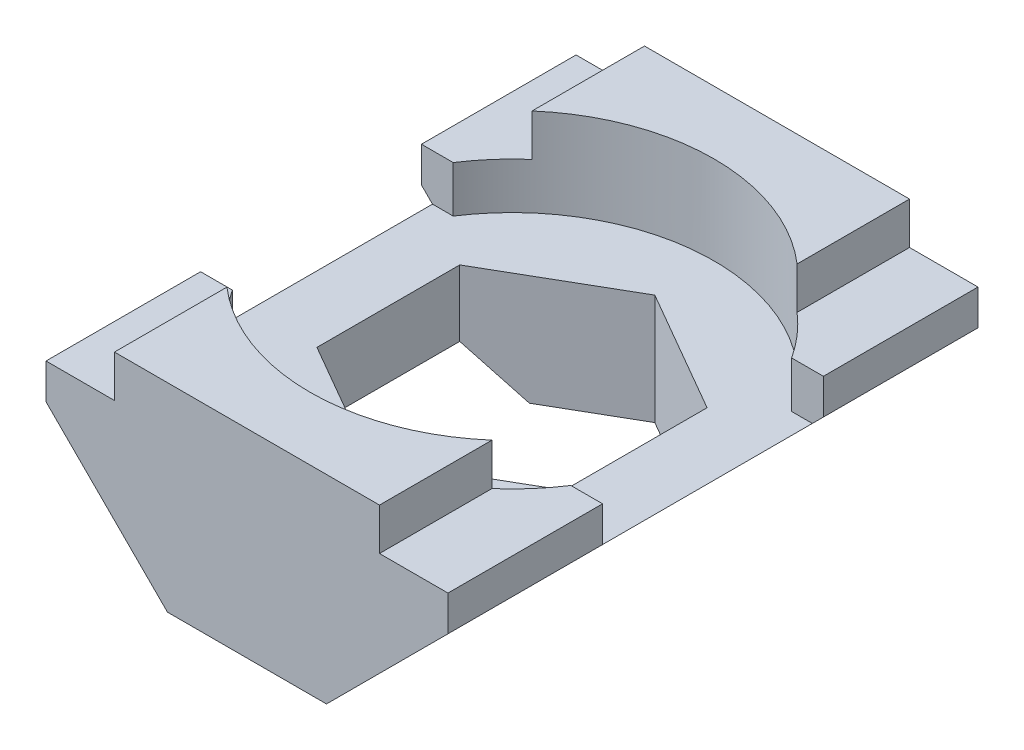
ISO-10303-21;
HEADER;
FILE_DESCRIPTION(('STEP AP214'),'2;1');
FILE_NAME('part.step','',(''),(''),'','','');
FILE_SCHEMA(('AUTOMOTIVE_DESIGN { 1 0 10303 214 1 1 1 1 }'));
ENDSEC;
DATA;
#1=APPLICATION_CONTEXT('core data for automotive mechanical design processes');
#2=APPLICATION_PROTOCOL_DEFINITION('international standard','automotive_design',2000,#1);
#3=PRODUCT_CONTEXT('',#1,'mechanical');
#4=PRODUCT('Part','Part','',(#3));
#5=PRODUCT_RELATED_PRODUCT_CATEGORY('part','',(#4));
#6=PRODUCT_DEFINITION_FORMATION('','',#4);
#7=PRODUCT_DEFINITION_CONTEXT('part definition',#1,'design');
#8=PRODUCT_DEFINITION('design','',#6,#7);
#9=PRODUCT_DEFINITION_SHAPE('','',#8);
#10=(LENGTH_UNIT() NAMED_UNIT(*) SI_UNIT(.MILLI.,.METRE.));
#11=(NAMED_UNIT(*) PLANE_ANGLE_UNIT() SI_UNIT($,.RADIAN.));
#12=(NAMED_UNIT(*) SI_UNIT($,.STERADIAN.) SOLID_ANGLE_UNIT());
#13=UNCERTAINTY_MEASURE_WITH_UNIT(LENGTH_MEASURE(1.E-05),#10,'distance_accuracy_value','');
#14=(GEOMETRIC_REPRESENTATION_CONTEXT(3) GLOBAL_UNCERTAINTY_ASSIGNED_CONTEXT((#13)) GLOBAL_UNIT_ASSIGNED_CONTEXT((#10,
#11,#12)) REPRESENTATION_CONTEXT('',''));
#15=CARTESIAN_POINT('',(0.,0.,0.));
#16=DIRECTION('',(0.,0.,1.));
#17=DIRECTION('',(1.,0.,0.));
#18=AXIS2_PLACEMENT_3D('',#15,#16,#17);
#19=CARTESIAN_POINT('',(4.79999999999999,-3.55,16.));
#20=DIRECTION('',(0.,1.,0.));
#21=DIRECTION('',(0.,0.,1.));
#22=AXIS2_PLACEMENT_3D('',#19,#20,#21);
#23=PLANE('',#22);
#24=DIRECTION('',(0.,0.,-1.));
#25=VECTOR('',#24,1.);
#26=CARTESIAN_POINT('',(4.79999999999999,-3.55,16.));
#27=LINE('',#26,#25);
#28=CARTESIAN_POINT('',(4.79999999999999,-3.55,14.));
#29=VERTEX_POINT('',#28);
#30=CARTESIAN_POINT('',(4.79999999999999,-3.55,10.1939310229206));
#31=VERTEX_POINT('',#30);
#32=EDGE_CURVE('E294',#29,#31,#27,.T.);
#33=ORIENTED_EDGE('',*,*,#32,.F.);
#34=DIRECTION('',(-1.,0.,0.));
#35=VECTOR('',#34,1.);
#36=CARTESIAN_POINT('',(-1.55,-3.55,14.));
#37=LINE('',#36,#35);
#38=CARTESIAN_POINT('',(1.20000000000001,-3.55,14.));
#39=VERTEX_POINT('',#38);
#40=EDGE_CURVE('E577',#29,#39,#37,.T.);
#41=ORIENTED_EDGE('',*,*,#40,.T.);
#42=DIRECTION('',(0.,0.,-1.));
#43=VECTOR('',#42,1.);
#44=CARTESIAN_POINT('',(1.20000000000001,-3.55,16.));
#45=LINE('',#44,#43);
#46=CARTESIAN_POINT('',(1.20000000000001,-3.55,10.1939310229206));
#47=VERTEX_POINT('',#46);
#48=EDGE_CURVE('E298',#39,#47,#45,.T.);
#49=ORIENTED_EDGE('',*,*,#48,.T.);
#50=DIRECTION('',(0.866025403784439,0.,0.499999999999999));
#51=VECTOR('',#50,1.);
#52=CARTESIAN_POINT('',(0.199999999999999,-3.55,9.61658075373095));
#53=LINE('',#52,#51);
#54=CARTESIAN_POINT('',(3.,-3.55,11.2331615074619));
#55=VERTEX_POINT('',#54);
#56=EDGE_CURVE('E469',#47,#55,#53,.T.);
#57=ORIENTED_EDGE('',*,*,#56,.T.);
#58=DIRECTION('',(0.866025403784438,0.,-0.5));
#59=VECTOR('',#58,1.);
#60=CARTESIAN_POINT('',(3.,-3.55,11.2331615074619));
#61=LINE('',#60,#59);
#62=EDGE_CURVE('E473',#55,#31,#61,.T.);
#63=ORIENTED_EDGE('',*,*,#62,.T.);
#64=EDGE_LOOP('',(#33,#41,#49,#57,#63));
#65=FACE_BOUND('',#64,.T.);
#66=ADVANCED_FACE('F38',(#65),#23,.F.);
#67=CARTESIAN_POINT('',(-1.55,0.,16.));
#68=DIRECTION('',(0.,-1.,0.));
#69=DIRECTION('',(1.,0.,0.));
#70=AXIS2_PLACEMENT_3D('',#67,#68,#69);
#71=PLANE('',#70);
#72=DIRECTION('',(0.,0.,-1.));
#73=VECTOR('',#72,1.);
#74=CARTESIAN_POINT('',(-1.55,0.,16.));
#75=LINE('',#74,#73);
#76=CARTESIAN_POINT('',(-1.55,0.,14.));
#77=VERTEX_POINT('',#76);
#78=CARTESIAN_POINT('',(-1.55,0.,10.5));
#79=VERTEX_POINT('',#78);
#80=EDGE_CURVE('E306',#77,#79,#75,.T.);
#81=ORIENTED_EDGE('',*,*,#80,.F.);
#82=DIRECTION('',(1.,0.,0.));
#83=VECTOR('',#82,1.);
#84=CARTESIAN_POINT('',(-1.55,0.,14.));
#85=LINE('',#84,#83);
#86=CARTESIAN_POINT('',(0.,0.,14.));
#87=VERTEX_POINT('',#86);
#88=EDGE_CURVE('E567',#77,#87,#85,.T.);
#89=ORIENTED_EDGE('',*,*,#88,.T.);
#90=DIRECTION('',(0.,0.,-1.));
#91=VECTOR('',#90,1.);
#92=CARTESIAN_POINT('',(0.,0.,16.));
#93=LINE('',#92,#91);
#94=CARTESIAN_POINT('',(0.,0.,11.4540736819008));
#95=VERTEX_POINT('',#94);
#96=EDGE_CURVE('E385',#87,#95,#93,.T.);
#97=ORIENTED_EDGE('',*,*,#96,.T.);
#98=CARTESIAN_POINT('',(3.,0.,8.));
#99=DIRECTION('',(0.,-1.,0.));
#100=DIRECTION('',(1.,0.,0.));
#101=AXIS2_PLACEMENT_3D('',#98,#99,#100);
#102=CIRCLE('',#101,4.575);
#103=CARTESIAN_POINT('',(-0.831530373101587,0.,10.5));
#104=VERTEX_POINT('',#103);
#105=EDGE_CURVE('E358',#95,#104,#102,.T.);
#106=ORIENTED_EDGE('',*,*,#105,.T.);
#107=DIRECTION('',(1.,0.,0.));
#108=VECTOR('',#107,1.);
#109=CARTESIAN_POINT('',(-1.55,0.,10.5));
#110=LINE('',#109,#108);
#111=EDGE_CURVE('E410',#79,#104,#110,.T.);
#112=ORIENTED_EDGE('',*,*,#111,.F.);
#113=EDGE_LOOP('',(#81,#89,#97,#106,#112));
#114=FACE_BOUND('',#113,.T.);
#115=ADVANCED_FACE('F643',(#114),#71,.F.);
#116=CARTESIAN_POINT('',(-1.55,-0.8,16.));
#117=DIRECTION('',(1.,0.,0.));
#118=DIRECTION('',(0.,0.,-1.));
#119=AXIS2_PLACEMENT_3D('',#116,#117,#118);
#120=PLANE('',#119);
#121=CARTESIAN_POINT('',(-1.55,0.,5.5));
#122=VERTEX_POINT('',#121);
#123=CARTESIAN_POINT('',(-1.55,0.,2.));
#124=VERTEX_POINT('',#123);
#125=EDGE_CURVE('E305',#122,#124,#75,.T.);
#126=ORIENTED_EDGE('',*,*,#125,.T.);
#127=DIRECTION('',(0.,1.,0.));
#128=VECTOR('',#127,1.);
#129=CARTESIAN_POINT('',(-1.55,-3.55,2.));
#130=LINE('',#129,#128);
#131=CARTESIAN_POINT('',(-1.55,-0.8,2.));
#132=VERTEX_POINT('',#131);
#133=EDGE_CURVE('E568',#132,#124,#130,.T.);
#134=ORIENTED_EDGE('',*,*,#133,.F.);
#135=DIRECTION('',(0.,0.,-1.));
#136=VECTOR('',#135,1.);
#137=CARTESIAN_POINT('',(-1.55,-0.8,16.));
#138=LINE('',#137,#136);
#139=CARTESIAN_POINT('',(-1.55,-0.800000000000002,5.5));
#140=VERTEX_POINT('',#139);
#141=EDGE_CURVE('E301',#140,#132,#138,.T.);
#142=ORIENTED_EDGE('',*,*,#141,.F.);
#143=DIRECTION('',(0.,1.,0.));
#144=VECTOR('',#143,1.);
#145=CARTESIAN_POINT('',(-1.55,-11.4331594420966,5.5));
#146=LINE('',#145,#144);
#147=EDGE_CURVE('E420',#140,#122,#146,.T.);
#148=ORIENTED_EDGE('',*,*,#147,.T.);
#149=EDGE_LOOP('',(#126,#134,#142,#148));
#150=FACE_BOUND('',#149,.T.);
#151=ADVANCED_FACE('F619',(#150),#120,.F.);
#152=CARTESIAN_POINT('',(7.55,0.,16.));
#153=DIRECTION('',(-1.,0.,0.));
#154=DIRECTION('',(0.,0.,1.));
#155=AXIS2_PLACEMENT_3D('',#152,#153,#154);
#156=PLANE('',#155);
#157=DIRECTION('',(0.,0.,-1.));
#158=VECTOR('',#157,1.);
#159=CARTESIAN_POINT('',(7.55,0.,16.));
#160=LINE('',#159,#158);
#161=CARTESIAN_POINT('',(7.55,0.,14.));
#162=VERTEX_POINT('',#161);
#163=CARTESIAN_POINT('',(7.55,0.,10.5));
#164=VERTEX_POINT('',#163);
#165=EDGE_CURVE('E286',#162,#164,#160,.T.);
#166=ORIENTED_EDGE('',*,*,#165,.F.);
#167=DIRECTION('',(0.,1.,0.));
#168=VECTOR('',#167,1.);
#169=CARTESIAN_POINT('',(7.55,-3.55,14.));
#170=LINE('',#169,#168);
#171=CARTESIAN_POINT('',(7.55,-0.799999999999999,14.));
#172=VERTEX_POINT('',#171);
#173=EDGE_CURVE('E581',#172,#162,#170,.T.);
#174=ORIENTED_EDGE('',*,*,#173,.F.);
#175=DIRECTION('',(0.,0.,-1.));
#176=VECTOR('',#175,1.);
#177=CARTESIAN_POINT('',(7.55,-0.799999999999999,16.));
#178=LINE('',#177,#176);
#179=CARTESIAN_POINT('',(7.55,-0.799999999999999,10.5));
#180=VERTEX_POINT('',#179);
#181=EDGE_CURVE('E290',#172,#180,#178,.T.);
#182=ORIENTED_EDGE('',*,*,#181,.T.);
#183=DIRECTION('',(0.,1.,0.));
#184=VECTOR('',#183,1.);
#185=CARTESIAN_POINT('',(7.55,-11.4331594420966,10.5));
#186=LINE('',#185,#184);
#187=EDGE_CURVE('E434',#180,#164,#186,.T.);
#188=ORIENTED_EDGE('',*,*,#187,.T.);
#189=EDGE_LOOP('',(#166,#174,#182,#188));
#190=FACE_BOUND('',#189,.T.);
#191=ADVANCED_FACE('F668',(#190),#156,.F.);
#192=CARTESIAN_POINT('',(6.,0.,16.));
#193=DIRECTION('',(0.,-1.,0.));
#194=DIRECTION('',(1.,0.,0.));
#195=AXIS2_PLACEMENT_3D('',#192,#193,#194);
#196=PLANE('',#195);
#197=DIRECTION('',(0.,0.,-1.));
#198=VECTOR('',#197,1.);
#199=CARTESIAN_POINT('',(6.,0.,16.));
#200=LINE('',#199,#198);
#201=CARTESIAN_POINT('',(6.,0.,14.));
#202=VERTEX_POINT('',#201);
#203=CARTESIAN_POINT('',(6.,0.,11.4540736819008));
#204=VERTEX_POINT('',#203);
#205=EDGE_CURVE('E282',#202,#204,#200,.T.);
#206=ORIENTED_EDGE('',*,*,#205,.F.);
#207=DIRECTION('',(1.,0.,0.));
#208=VECTOR('',#207,1.);
#209=CARTESIAN_POINT('',(6.,0.,14.));
#210=LINE('',#209,#208);
#211=EDGE_CURVE('E267',#202,#162,#210,.T.);
#212=ORIENTED_EDGE('',*,*,#211,.T.);
#213=ORIENTED_EDGE('',*,*,#165,.T.);
#214=CARTESIAN_POINT('',(6.83153037310159,0.,10.5));
#215=VERTEX_POINT('',#214);
#216=EDGE_CURVE('E406',#215,#164,#110,.T.);
#217=ORIENTED_EDGE('',*,*,#216,.F.);
#218=CARTESIAN_POINT('',(3.,0.,8.));
#219=DIRECTION('',(0.,-1.,0.));
#220=DIRECTION('',(1.,0.,0.));
#221=AXIS2_PLACEMENT_3D('',#218,#219,#220);
#222=CIRCLE('',#221,4.575);
#223=EDGE_CURVE('E341',#215,#204,#222,.T.);
#224=ORIENTED_EDGE('',*,*,#223,.T.);
#225=EDGE_LOOP('',(#206,#212,#213,#217,#224));
#226=FACE_BOUND('',#225,.T.);
#227=ADVANCED_FACE('F629',(#226),#196,.F.);
#228=CARTESIAN_POINT('',(6.,0.95,16.));
#229=DIRECTION('',(-1.,0.,0.));
#230=DIRECTION('',(0.,0.,1.));
#231=AXIS2_PLACEMENT_3D('',#228,#229,#230);
#232=PLANE('',#231);
#233=DIRECTION('',(0.,0.,-1.));
#234=VECTOR('',#233,1.);
#235=CARTESIAN_POINT('',(6.,0.95,16.));
#236=LINE('',#235,#234);
#237=CARTESIAN_POINT('',(6.,0.95,14.));
#238=VERTEX_POINT('',#237);
#239=CARTESIAN_POINT('',(6.,0.95,11.4540736819008));
#240=VERTEX_POINT('',#239);
#241=EDGE_CURVE('E273',#238,#240,#236,.T.);
#242=ORIENTED_EDGE('',*,*,#241,.F.);
#243=DIRECTION('',(0.,-1.,0.));
#244=VECTOR('',#243,1.);
#245=CARTESIAN_POINT('',(6.,0.95,14.));
#246=LINE('',#245,#244);
#247=EDGE_CURVE('E596',#238,#202,#246,.T.);
#248=ORIENTED_EDGE('',*,*,#247,.T.);
#249=ORIENTED_EDGE('',*,*,#205,.T.);
#250=DIRECTION('',(0.,1.,0.));
#251=VECTOR('',#250,1.);
#252=CARTESIAN_POINT('',(6.,-1.05,11.4540736819008));
#253=LINE('',#252,#251);
#254=EDGE_CURVE('E378',#204,#240,#253,.T.);
#255=ORIENTED_EDGE('',*,*,#254,.T.);
#256=EDGE_LOOP('',(#242,#248,#249,#255));
#257=FACE_BOUND('',#256,.T.);
#258=ADVANCED_FACE('F634',(#257),#232,.F.);
#259=CARTESIAN_POINT('',(0.,0.95,16.));
#260=DIRECTION('',(0.,-1.,0.));
#261=DIRECTION('',(0.,0.,-1.));
#262=AXIS2_PLACEMENT_3D('',#259,#260,#261);
#263=PLANE('',#262);
#264=DIRECTION('',(0.,0.,-1.));
#265=VECTOR('',#264,1.);
#266=CARTESIAN_POINT('',(0.,0.95,16.));
#267=LINE('',#266,#265);
#268=CARTESIAN_POINT('',(0.,0.95,14.));
#269=VERTEX_POINT('',#268);
#270=CARTESIAN_POINT('',(0.,0.95,11.4540736819008));
#271=VERTEX_POINT('',#270);
#272=EDGE_CURVE('E274',#269,#271,#267,.T.);
#273=ORIENTED_EDGE('',*,*,#272,.F.);
#274=DIRECTION('',(-1.,0.,0.));
#275=VECTOR('',#274,1.);
#276=CARTESIAN_POINT('',(-1.55,0.95,14.));
#277=LINE('',#276,#275);
#278=EDGE_CURVE('E62',#238,#269,#277,.T.);
#279=ORIENTED_EDGE('',*,*,#278,.F.);
#280=ORIENTED_EDGE('',*,*,#241,.T.);
#281=CARTESIAN_POINT('',(3.,0.95,8.));
#282=DIRECTION('',(0.,1.,0.));
#283=DIRECTION('',(0.,0.,1.));
#284=AXIS2_PLACEMENT_3D('',#281,#282,#283);
#285=CIRCLE('',#284,4.575);
#286=EDGE_CURVE('E359',#271,#240,#285,.T.);
#287=ORIENTED_EDGE('',*,*,#286,.F.);
#288=EDGE_LOOP('',(#273,#279,#280,#287));
#289=FACE_BOUND('',#288,.T.);
#290=ADVANCED_FACE('F638',(#289),#263,.F.);
#291=CARTESIAN_POINT('',(0.,0.,16.));
#292=DIRECTION('',(1.,0.,0.));
#293=DIRECTION('',(0.,0.,-1.));
#294=AXIS2_PLACEMENT_3D('',#291,#292,#293);
#295=PLANE('',#294);
#296=CARTESIAN_POINT('',(0.,0.95,4.54592631809916));
#297=VERTEX_POINT('',#296);
#298=CARTESIAN_POINT('',(0.,0.95,2.));
#299=VERTEX_POINT('',#298);
#300=EDGE_CURVE('E278',#297,#299,#267,.T.);
#301=ORIENTED_EDGE('',*,*,#300,.T.);
#302=DIRECTION('',(0.,-1.,0.));
#303=VECTOR('',#302,1.);
#304=CARTESIAN_POINT('',(0.,0.,2.));
#305=LINE('',#304,#303);
#306=CARTESIAN_POINT('',(0.,0.,2.));
#307=VERTEX_POINT('',#306);
#308=EDGE_CURVE('E54',#299,#307,#305,.T.);
#309=ORIENTED_EDGE('',*,*,#308,.T.);
#310=CARTESIAN_POINT('',(0.,0.,4.54592631809916));
#311=VERTEX_POINT('',#310);
#312=EDGE_CURVE('E384',#311,#307,#93,.T.);
#313=ORIENTED_EDGE('',*,*,#312,.F.);
#314=DIRECTION('',(0.,1.,0.));
#315=VECTOR('',#314,1.);
#316=CARTESIAN_POINT('',(0.,-1.05,4.54592631809916));
#317=LINE('',#316,#315);
#318=EDGE_CURVE('E313',#311,#297,#317,.T.);
#319=ORIENTED_EDGE('',*,*,#318,.T.);
#320=EDGE_LOOP('',(#301,#309,#313,#319));
#321=FACE_BOUND('',#320,.T.);
#322=ADVANCED_FACE('F404',(#321),#295,.F.);
#323=ORIENTED_EDGE('',*,*,#312,.T.);
#324=DIRECTION('',(-1.,0.,0.));
#325=VECTOR('',#324,1.);
#326=CARTESIAN_POINT('',(-1.55,0.,2.));
#327=LINE('',#326,#325);
#328=EDGE_CURVE('E398',#307,#124,#327,.T.);
#329=ORIENTED_EDGE('',*,*,#328,.T.);
#330=ORIENTED_EDGE('',*,*,#125,.F.);
#331=DIRECTION('',(-1.,0.,0.));
#332=VECTOR('',#331,1.);
#333=CARTESIAN_POINT('',(-1.55,0.,5.5));
#334=LINE('',#333,#332);
#335=CARTESIAN_POINT('',(-0.83153037310159,0.,5.5));
#336=VERTEX_POINT('',#335);
#337=EDGE_CURVE('E423',#336,#122,#334,.T.);
#338=ORIENTED_EDGE('',*,*,#337,.F.);
#339=EDGE_CURVE('E370',#336,#311,#102,.T.);
#340=ORIENTED_EDGE('',*,*,#339,.T.);
#341=EDGE_LOOP('',(#323,#329,#330,#338,#340));
#342=FACE_BOUND('',#341,.T.);
#343=ADVANCED_FACE('F40',(#342),#71,.F.);
#344=CARTESIAN_POINT('',(-1.55,-0.8,14.));
#345=VERTEX_POINT('',#344);
#346=CARTESIAN_POINT('',(-1.55,-0.800000000000002,10.5));
#347=VERTEX_POINT('',#346);
#348=EDGE_CURVE('E302',#345,#347,#138,.T.);
#349=ORIENTED_EDGE('',*,*,#348,.F.);
#350=DIRECTION('',(0.,1.,0.));
#351=VECTOR('',#350,1.);
#352=CARTESIAN_POINT('',(-1.55,-3.55,14.));
#353=LINE('',#352,#351);
#354=EDGE_CURVE('E255',#345,#77,#353,.T.);
#355=ORIENTED_EDGE('',*,*,#354,.T.);
#356=ORIENTED_EDGE('',*,*,#80,.T.);
#357=DIRECTION('',(0.,1.,0.));
#358=VECTOR('',#357,1.);
#359=CARTESIAN_POINT('',(-1.55,-11.4331594420966,10.5));
#360=LINE('',#359,#358);
#361=EDGE_CURVE('E427',#347,#79,#360,.T.);
#362=ORIENTED_EDGE('',*,*,#361,.F.);
#363=EDGE_LOOP('',(#349,#355,#356,#362));
#364=FACE_BOUND('',#363,.T.);
#365=ADVANCED_FACE('F650',(#364),#120,.F.);
#366=CARTESIAN_POINT('',(1.20000000000001,-3.55,16.));
#367=DIRECTION('',(0.707106781186546,0.707106781186549,0.));
#368=DIRECTION('',(-0.707106781186549,0.707106781186546,0.));
#369=AXIS2_PLACEMENT_3D('',#366,#367,#368);
#370=PLANE('',#369);
#371=ORIENTED_EDGE('',*,*,#141,.T.);
#372=DIRECTION('',(0.707106781186549,-0.707106781186546,0.));
#373=VECTOR('',#372,1.);
#374=CARTESIAN_POINT('',(1.20000000000001,-3.55,2.));
#375=LINE('',#374,#373);
#376=CARTESIAN_POINT('',(1.20000000000001,-3.55,2.));
#377=VERTEX_POINT('',#376);
#378=EDGE_CURVE('E412',#132,#377,#375,.T.);
#379=ORIENTED_EDGE('',*,*,#378,.T.);
#380=CARTESIAN_POINT('',(1.20000000000001,-3.55,5.80606897707941));
#381=VERTEX_POINT('',#380);
#382=EDGE_CURVE('E297',#381,#377,#45,.T.);
#383=ORIENTED_EDGE('',*,*,#382,.F.);
#384=DIRECTION('',(-0.654653670707978,0.654653670707976,0.377964473009228));
#385=VECTOR('',#384,1.);
#386=CARTESIAN_POINT('',(-1.32234378007872,-1.02765621992128,7.26234483749665));
#387=LINE('',#386,#385);
#388=CARTESIAN_POINT('',(0.199999999999997,-2.54999999999999,6.38341924626905));
#389=VERTEX_POINT('',#388);
#390=EDGE_CURVE('E499',#381,#389,#387,.T.);
#391=ORIENTED_EDGE('',*,*,#390,.T.);
#392=DIRECTION('',(0.,0.,1.));
#393=VECTOR('',#392,1.);
#394=CARTESIAN_POINT('',(0.200000000000002,-2.54999999999999,16.));
#395=LINE('',#394,#393);
#396=CARTESIAN_POINT('',(0.199999999999999,-2.54999999999999,9.61658075373095));
#397=VERTEX_POINT('',#396);
#398=EDGE_CURVE('E521',#389,#397,#395,.T.);
#399=ORIENTED_EDGE('',*,*,#398,.T.);
#400=DIRECTION('',(0.654653670707979,-0.654653670707976,0.377964473009227));
#401=VECTOR('',#400,1.);
#402=CARTESIAN_POINT('',(2.63662949436445,-4.98662949436443,11.0233694482176));
#403=LINE('',#402,#401);
#404=EDGE_CURVE('E525',#397,#47,#403,.T.);
#405=ORIENTED_EDGE('',*,*,#404,.T.);
#406=ORIENTED_EDGE('',*,*,#48,.F.);
#407=DIRECTION('',(-0.707106781186549,0.707106781186546,0.));
#408=VECTOR('',#407,1.);
#409=CARTESIAN_POINT('',(1.20000000000001,-3.55,14.));
#410=LINE('',#409,#408);
#411=EDGE_CURVE('E592',#39,#345,#410,.T.);
#412=ORIENTED_EDGE('',*,*,#411,.T.);
#413=ORIENTED_EDGE('',*,*,#348,.T.);
#414=DIRECTION('',(0.707106781186549,-0.707106781186546,0.));
#415=VECTOR('',#414,1.);
#416=CARTESIAN_POINT('',(1.20000000000001,-3.55,10.5));
#417=LINE('',#416,#415);
#418=CARTESIAN_POINT('',(-1.3,-1.05,10.5));
#419=VERTEX_POINT('',#418);
#420=EDGE_CURVE('E455',#347,#419,#417,.T.);
#421=ORIENTED_EDGE('',*,*,#420,.T.);
#422=DIRECTION('',(0.,0.,1.));
#423=VECTOR('',#422,1.);
#424=CARTESIAN_POINT('',(-1.3,-1.05,16.));
#425=LINE('',#424,#423);
#426=CARTESIAN_POINT('',(-1.3,-1.05,5.5));
#427=VERTEX_POINT('',#426);
#428=EDGE_CURVE('E382',#427,#419,#425,.T.);
#429=ORIENTED_EDGE('',*,*,#428,.F.);
#430=DIRECTION('',(-0.707106781186549,0.707106781186546,0.));
#431=VECTOR('',#430,1.);
#432=CARTESIAN_POINT('',(1.20000000000001,-3.55,5.5));
#433=LINE('',#432,#431);
#434=EDGE_CURVE('E447',#427,#140,#433,.T.);
#435=ORIENTED_EDGE('',*,*,#434,.T.);
#436=EDGE_LOOP('',(#371,#379,#383,#391,#399,#405,#406,#412,#413,#421,#429,#435));
#437=FACE_BOUND('',#436,.T.);
#438=ADVANCED_FACE('F612',(#437),#370,.F.);
#439=ORIENTED_EDGE('',*,*,#382,.T.);
#440=DIRECTION('',(1.,0.,0.));
#441=VECTOR('',#440,1.);
#442=CARTESIAN_POINT('',(-1.55,-3.55,2.));
#443=LINE('',#442,#441);
#444=CARTESIAN_POINT('',(4.79999999999999,-3.55,2.));
#445=VERTEX_POINT('',#444);
#446=EDGE_CURVE('E254',#377,#445,#443,.T.);
#447=ORIENTED_EDGE('',*,*,#446,.T.);
#448=CARTESIAN_POINT('',(4.79999999999999,-3.55,5.80606897707941));
#449=VERTEX_POINT('',#448);
#450=EDGE_CURVE('E293',#449,#445,#27,.T.);
#451=ORIENTED_EDGE('',*,*,#450,.F.);
#452=DIRECTION('',(-0.866025403784439,0.,-0.499999999999999));
#453=VECTOR('',#452,1.);
#454=CARTESIAN_POINT('',(5.8,-3.55,6.38341924626904));
#455=LINE('',#454,#453);
#456=CARTESIAN_POINT('',(3.,-3.55,4.7668384925381));
#457=VERTEX_POINT('',#456);
#458=EDGE_CURVE('E460',#449,#457,#455,.T.);
#459=ORIENTED_EDGE('',*,*,#458,.T.);
#460=DIRECTION('',(-0.866025403784439,0.,0.5));
#461=VECTOR('',#460,1.);
#462=CARTESIAN_POINT('',(3.,-3.55,4.7668384925381));
#463=LINE('',#462,#461);
#464=EDGE_CURVE('E464',#457,#381,#463,.T.);
#465=ORIENTED_EDGE('',*,*,#464,.T.);
#466=EDGE_LOOP('',(#439,#447,#451,#459,#465));
#467=FACE_BOUND('',#466,.T.);
#468=ADVANCED_FACE('F548',(#467),#23,.F.);
#469=CARTESIAN_POINT('',(7.55,-0.799999999999999,16.));
#470=DIRECTION('',(-0.707106781186546,0.707106781186549,0.));
#471=DIRECTION('',(-0.707106781186549,-0.707106781186546,0.));
#472=AXIS2_PLACEMENT_3D('',#469,#470,#471);
#473=PLANE('',#472);
#474=ORIENTED_EDGE('',*,*,#450,.T.);
#475=DIRECTION('',(0.707106781186549,0.707106781186546,0.));
#476=VECTOR('',#475,1.);
#477=CARTESIAN_POINT('',(7.55,-0.799999999999999,2.));
#478=LINE('',#477,#476);
#479=CARTESIAN_POINT('',(7.55,-0.799999999999999,2.));
#480=VERTEX_POINT('',#479);
#481=EDGE_CURVE('E605',#445,#480,#478,.T.);
#482=ORIENTED_EDGE('',*,*,#481,.T.);
#483=CARTESIAN_POINT('',(7.55,-0.799999999999999,5.5));
#484=VERTEX_POINT('',#483);
#485=EDGE_CURVE('E289',#484,#480,#178,.T.);
#486=ORIENTED_EDGE('',*,*,#485,.F.);
#487=DIRECTION('',(-0.707106781186549,-0.707106781186546,0.));
#488=VECTOR('',#487,1.);
#489=CARTESIAN_POINT('',(7.55,-0.799999999999999,5.5));
#490=LINE('',#489,#488);
#491=CARTESIAN_POINT('',(7.3,-1.05,5.5));
#492=VERTEX_POINT('',#491);
#493=EDGE_CURVE('E443',#484,#492,#490,.T.);
#494=ORIENTED_EDGE('',*,*,#493,.T.);
#495=DIRECTION('',(0.,0.,-1.));
#496=VECTOR('',#495,1.);
#497=CARTESIAN_POINT('',(7.3,-1.05,16.));
#498=LINE('',#497,#496);
#499=CARTESIAN_POINT('',(7.3,-1.05,10.5));
#500=VERTEX_POINT('',#499);
#501=EDGE_CURVE('E317',#500,#492,#498,.T.);
#502=ORIENTED_EDGE('',*,*,#501,.F.);
#503=DIRECTION('',(0.707106781186549,0.707106781186546,0.));
#504=VECTOR('',#503,1.);
#505=CARTESIAN_POINT('',(7.55,-0.799999999999999,10.5));
#506=LINE('',#505,#504);
#507=EDGE_CURVE('E451',#500,#180,#506,.T.);
#508=ORIENTED_EDGE('',*,*,#507,.T.);
#509=ORIENTED_EDGE('',*,*,#181,.F.);
#510=DIRECTION('',(-0.707106781186549,-0.707106781186546,0.));
#511=VECTOR('',#510,1.);
#512=CARTESIAN_POINT('',(7.55,-0.799999999999999,14.));
#513=LINE('',#512,#511);
#514=EDGE_CURVE('E572',#172,#29,#513,.T.);
#515=ORIENTED_EDGE('',*,*,#514,.T.);
#516=ORIENTED_EDGE('',*,*,#32,.T.);
#517=DIRECTION('',(0.654653670707978,0.654653670707976,-0.377964473009228));
#518=VECTOR('',#517,1.);
#519=CARTESIAN_POINT('',(5.72051336277842,-2.62948663722157,9.66247238512781));
#520=LINE('',#519,#518);
#521=CARTESIAN_POINT('',(5.8,-2.54999999999999,9.61658075373095));
#522=VERTEX_POINT('',#521);
#523=EDGE_CURVE('E529',#31,#522,#520,.T.);
#524=ORIENTED_EDGE('',*,*,#523,.T.);
#525=DIRECTION('',(0.,0.,-1.));
#526=VECTOR('',#525,1.);
#527=CARTESIAN_POINT('',(5.8,-2.54999999999999,16.));
#528=LINE('',#527,#526);
#529=CARTESIAN_POINT('',(5.8,-2.54999999999999,6.38341924626904));
#530=VERTEX_POINT('',#529);
#531=EDGE_CURVE('E532',#522,#530,#528,.T.);
#532=ORIENTED_EDGE('',*,*,#531,.T.);
#533=DIRECTION('',(-0.654653670707979,-0.654653670707976,-0.377964473009227));
#534=VECTOR('',#533,1.);
#535=CARTESIAN_POINT('',(9.67948663722158,1.32948663722157,8.62324190058647));
#536=LINE('',#535,#534);
#537=EDGE_CURVE('E362',#530,#449,#536,.T.);
#538=ORIENTED_EDGE('',*,*,#537,.T.);
#539=EDGE_LOOP('',(#474,#482,#486,#494,#502,#508,#509,#515,#516,#524,#532,#538));
#540=FACE_BOUND('',#539,.T.);
#541=ADVANCED_FACE('F541',(#540),#473,.F.);
#542=ORIENTED_EDGE('',*,*,#485,.T.);
#543=DIRECTION('',(0.,1.,0.));
#544=VECTOR('',#543,1.);
#545=CARTESIAN_POINT('',(7.55,-3.55,2.));
#546=LINE('',#545,#544);
#547=CARTESIAN_POINT('',(7.55,0.,2.));
#548=VERTEX_POINT('',#547);
#549=EDGE_CURVE('E565',#480,#548,#546,.T.);
#550=ORIENTED_EDGE('',*,*,#549,.T.);
#551=CARTESIAN_POINT('',(7.55,0.,5.5));
#552=VERTEX_POINT('',#551);
#553=EDGE_CURVE('E285',#552,#548,#160,.T.);
#554=ORIENTED_EDGE('',*,*,#553,.F.);
#555=DIRECTION('',(0.,1.,0.));
#556=VECTOR('',#555,1.);
#557=CARTESIAN_POINT('',(7.55,-11.4331594420966,5.5));
#558=LINE('',#557,#556);
#559=EDGE_CURVE('E431',#484,#552,#558,.T.);
#560=ORIENTED_EDGE('',*,*,#559,.F.);
#561=EDGE_LOOP('',(#542,#550,#554,#560));
#562=FACE_BOUND('',#561,.T.);
#563=ADVANCED_FACE('F563',(#562),#156,.F.);
#564=ORIENTED_EDGE('',*,*,#553,.T.);
#565=DIRECTION('',(-1.,0.,0.));
#566=VECTOR('',#565,1.);
#567=CARTESIAN_POINT('',(6.,0.,2.));
#568=LINE('',#567,#566);
#569=CARTESIAN_POINT('',(6.,0.,2.));
#570=VERTEX_POINT('',#569);
#571=EDGE_CURVE('E266',#548,#570,#568,.T.);
#572=ORIENTED_EDGE('',*,*,#571,.T.);
#573=CARTESIAN_POINT('',(6.,0.,4.54592631809916));
#574=VERTEX_POINT('',#573);
#575=EDGE_CURVE('E264',#574,#570,#200,.T.);
#576=ORIENTED_EDGE('',*,*,#575,.F.);
#577=CARTESIAN_POINT('',(6.83153037310159,0.,5.5));
#578=VERTEX_POINT('',#577);
#579=EDGE_CURVE('E374',#574,#578,#222,.T.);
#580=ORIENTED_EDGE('',*,*,#579,.T.);
#581=EDGE_CURVE('E424',#552,#578,#334,.T.);
#582=ORIENTED_EDGE('',*,*,#581,.F.);
#583=EDGE_LOOP('',(#564,#572,#576,#580,#582));
#584=FACE_BOUND('',#583,.T.);
#585=ADVANCED_FACE('F559',(#584),#196,.F.);
#586=ORIENTED_EDGE('',*,*,#575,.T.);
#587=DIRECTION('',(0.,1.,0.));
#588=VECTOR('',#587,1.);
#589=CARTESIAN_POINT('',(6.,0.95,2.));
#590=LINE('',#589,#588);
#591=CARTESIAN_POINT('',(6.,0.95,2.));
#592=VERTEX_POINT('',#591);
#593=EDGE_CURVE('E247',#570,#592,#590,.T.);
#594=ORIENTED_EDGE('',*,*,#593,.T.);
#595=CARTESIAN_POINT('',(6.,0.95,4.54592631809916));
#596=VERTEX_POINT('',#595);
#597=EDGE_CURVE('E262',#596,#592,#236,.T.);
#598=ORIENTED_EDGE('',*,*,#597,.F.);
#599=DIRECTION('',(0.,1.,0.));
#600=VECTOR('',#599,1.);
#601=CARTESIAN_POINT('',(6.,-1.05,4.54592631809916));
#602=LINE('',#601,#600);
#603=EDGE_CURVE('E371',#596,#574,#602,.F.);
#604=ORIENTED_EDGE('',*,*,#603,.T.);
#605=EDGE_LOOP('',(#586,#594,#598,#604));
#606=FACE_BOUND('',#605,.T.);
#607=ADVANCED_FACE('F260',(#606),#232,.F.);
#608=ORIENTED_EDGE('',*,*,#597,.T.);
#609=DIRECTION('',(1.,0.,0.));
#610=VECTOR('',#609,1.);
#611=CARTESIAN_POINT('',(-1.55,0.95,2.));
#612=LINE('',#611,#610);
#613=EDGE_CURVE('E244',#299,#592,#612,.T.);
#614=ORIENTED_EDGE('',*,*,#613,.F.);
#615=ORIENTED_EDGE('',*,*,#300,.F.);
#616=EDGE_CURVE('E271',#596,#297,#285,.T.);
#617=ORIENTED_EDGE('',*,*,#616,.F.);
#618=EDGE_LOOP('',(#608,#614,#615,#617));
#619=FACE_BOUND('',#618,.T.);
#620=ADVANCED_FACE('F270',(#619),#263,.F.);
#621=ORIENTED_EDGE('',*,*,#96,.F.);
#622=DIRECTION('',(0.,1.,0.));
#623=VECTOR('',#622,1.);
#624=CARTESIAN_POINT('',(0.,0.,14.));
#625=LINE('',#624,#623);
#626=EDGE_CURVE('E11',#87,#269,#625,.T.);
#627=ORIENTED_EDGE('',*,*,#626,.T.);
#628=ORIENTED_EDGE('',*,*,#272,.T.);
#629=DIRECTION('',(0.,1.,0.));
#630=VECTOR('',#629,1.);
#631=CARTESIAN_POINT('',(0.,-1.05,11.4540736819008));
#632=LINE('',#631,#630);
#633=EDGE_CURVE('E309',#271,#95,#632,.F.);
#634=ORIENTED_EDGE('',*,*,#633,.T.);
#635=EDGE_LOOP('',(#621,#627,#628,#634));
#636=FACE_BOUND('',#635,.T.);
#637=ADVANCED_FACE('F640',(#636),#295,.F.);
#638=CARTESIAN_POINT('',(3.,-1.05,8.));
#639=DIRECTION('',(0.,1.,0.));
#640=DIRECTION('',(0.,0.,1.));
#641=AXIS2_PLACEMENT_3D('',#638,#639,#640);
#642=PLANE('',#641);
#643=DIRECTION('',(-0.866025403784439,0.,0.5));
#644=VECTOR('',#643,1.);
#645=CARTESIAN_POINT('',(3.,-1.05,4.7668384925381));
#646=LINE('',#645,#644);
#647=CARTESIAN_POINT('',(3.,-1.05,4.7668384925381));
#648=VERTEX_POINT('',#647);
#649=CARTESIAN_POINT('',(0.199999999999997,-1.05,6.38341924626905));
#650=VERTEX_POINT('',#649);
#651=EDGE_CURVE('E480',#648,#650,#646,.T.);
#652=ORIENTED_EDGE('',*,*,#651,.F.);
#653=DIRECTION('',(-0.866025403784439,0.,-0.499999999999999));
#654=VECTOR('',#653,1.);
#655=CARTESIAN_POINT('',(5.8,-1.05,6.38341924626904));
#656=LINE('',#655,#654);
#657=CARTESIAN_POINT('',(5.8,-1.05,6.38341924626904));
#658=VERTEX_POINT('',#657);
#659=EDGE_CURVE('E459',#658,#648,#656,.T.);
#660=ORIENTED_EDGE('',*,*,#659,.F.);
#661=DIRECTION('',(0.,0.,-1.));
#662=VECTOR('',#661,1.);
#663=CARTESIAN_POINT('',(5.8,-1.05,9.61658075373095));
#664=LINE('',#663,#662);
#665=CARTESIAN_POINT('',(5.8,-1.05,9.61658075373095));
#666=VERTEX_POINT('',#665);
#667=EDGE_CURVE('E465',#666,#658,#664,.T.);
#668=ORIENTED_EDGE('',*,*,#667,.F.);
#669=DIRECTION('',(0.866025403784438,0.,-0.5));
#670=VECTOR('',#669,1.);
#671=CARTESIAN_POINT('',(3.,-1.05,11.2331615074619));
#672=LINE('',#671,#670);
#673=CARTESIAN_POINT('',(3.,-1.05,11.2331615074619));
#674=VERTEX_POINT('',#673);
#675=EDGE_CURVE('E490',#674,#666,#672,.T.);
#676=ORIENTED_EDGE('',*,*,#675,.F.);
#677=DIRECTION('',(0.866025403784439,0.,0.499999999999999));
#678=VECTOR('',#677,1.);
#679=CARTESIAN_POINT('',(0.199999999999999,-1.05,9.61658075373095));
#680=LINE('',#679,#678);
#681=CARTESIAN_POINT('',(0.199999999999999,-1.05,9.61658075373095));
#682=VERTEX_POINT('',#681);
#683=EDGE_CURVE('E487',#682,#674,#680,.T.);
#684=ORIENTED_EDGE('',*,*,#683,.F.);
#685=DIRECTION('',(0.,0.,1.));
#686=VECTOR('',#685,1.);
#687=CARTESIAN_POINT('',(0.199999999999997,-1.05,6.38341924626905));
#688=LINE('',#687,#686);
#689=EDGE_CURVE('E483',#650,#682,#688,.T.);
#690=ORIENTED_EDGE('',*,*,#689,.F.);
#691=EDGE_LOOP('',(#652,#660,#668,#676,#684,#690));
#692=FACE_BOUND('',#691,.T.);
#693=DIRECTION('',(1.,0.,0.));
#694=VECTOR('',#693,1.);
#695=CARTESIAN_POINT('',(-1.55,-1.05,5.5));
#696=LINE('',#695,#694);
#697=CARTESIAN_POINT('',(6.83153037310159,-1.05,5.5));
#698=VERTEX_POINT('',#697);
#699=EDGE_CURVE('E416',#698,#492,#696,.T.);
#700=ORIENTED_EDGE('',*,*,#699,.F.);
#701=CARTESIAN_POINT('',(3.,-1.05,8.));
#702=DIRECTION('',(0.,1.,0.));
#703=DIRECTION('',(0.,0.,1.));
#704=AXIS2_PLACEMENT_3D('',#701,#702,#703);
#705=CIRCLE('',#704,4.575);
#706=CARTESIAN_POINT('',(-0.83153037310159,-1.05,5.5));
#707=VERTEX_POINT('',#706);
#708=EDGE_CURVE('E353',#698,#707,#705,.T.);
#709=ORIENTED_EDGE('',*,*,#708,.T.);
#710=EDGE_CURVE('E419',#427,#707,#696,.T.);
#711=ORIENTED_EDGE('',*,*,#710,.F.);
#712=ORIENTED_EDGE('',*,*,#428,.T.);
#713=DIRECTION('',(-1.,0.,0.));
#714=VECTOR('',#713,1.);
#715=CARTESIAN_POINT('',(-1.55,-1.05,10.5));
#716=LINE('',#715,#714);
#717=CARTESIAN_POINT('',(-0.831530373101587,-1.05,10.5));
#718=VERTEX_POINT('',#717);
#719=EDGE_CURVE('E350',#718,#419,#716,.T.);
#720=ORIENTED_EDGE('',*,*,#719,.F.);
#721=CARTESIAN_POINT('',(6.83153037310159,-1.05,10.5));
#722=VERTEX_POINT('',#721);
#723=EDGE_CURVE('E338',#718,#722,#705,.T.);
#724=ORIENTED_EDGE('',*,*,#723,.T.);
#725=EDGE_CURVE('E348',#500,#722,#716,.T.);
#726=ORIENTED_EDGE('',*,*,#725,.F.);
#727=ORIENTED_EDGE('',*,*,#501,.T.);
#728=EDGE_LOOP('',(#700,#709,#711,#712,#720,#724,#726,#727));
#729=FACE_BOUND('',#728,.T.);
#730=ADVANCED_FACE('F347',(#692,#729),#642,.T.);
#731=CARTESIAN_POINT('',(3.,-1.05,8.));
#732=DIRECTION('',(0.,1.,0.));
#733=DIRECTION('',(0.,0.,1.));
#734=AXIS2_PLACEMENT_3D('',#731,#732,#733);
#735=CYLINDRICAL_SURFACE('',#734,4.575);
#736=ORIENTED_EDGE('',*,*,#223,.F.);
#737=DIRECTION('',(0.,1.,0.));
#738=VECTOR('',#737,1.);
#739=CARTESIAN_POINT('',(6.83153037310159,-1.05,10.5));
#740=LINE('',#739,#738);
#741=EDGE_CURVE('E47',#215,#722,#740,.F.);
#742=ORIENTED_EDGE('',*,*,#741,.T.);
#743=ORIENTED_EDGE('',*,*,#723,.F.);
#744=DIRECTION('',(0.,1.,0.));
#745=VECTOR('',#744,1.);
#746=CARTESIAN_POINT('',(-0.831530373101587,-1.05,10.5));
#747=LINE('',#746,#745);
#748=EDGE_CURVE('E328',#718,#104,#747,.T.);
#749=ORIENTED_EDGE('',*,*,#748,.T.);
#750=ORIENTED_EDGE('',*,*,#105,.F.);
#751=ORIENTED_EDGE('',*,*,#633,.F.);
#752=ORIENTED_EDGE('',*,*,#286,.T.);
#753=ORIENTED_EDGE('',*,*,#254,.F.);
#754=EDGE_LOOP('',(#736,#742,#743,#749,#750,#751,#752,#753));
#755=FACE_BOUND('',#754,.T.);
#756=ADVANCED_FACE('F337',(#755),#735,.F.);
#757=ORIENTED_EDGE('',*,*,#339,.F.);
#758=DIRECTION('',(0.,1.,0.));
#759=VECTOR('',#758,1.);
#760=CARTESIAN_POINT('',(-0.83153037310159,-1.05,5.5));
#761=LINE('',#760,#759);
#762=EDGE_CURVE('E324',#336,#707,#761,.F.);
#763=ORIENTED_EDGE('',*,*,#762,.T.);
#764=ORIENTED_EDGE('',*,*,#708,.F.);
#765=DIRECTION('',(0.,1.,0.));
#766=VECTOR('',#765,1.);
#767=CARTESIAN_POINT('',(6.83153037310159,-1.05,5.5));
#768=LINE('',#767,#766);
#769=EDGE_CURVE('E320',#698,#578,#768,.T.);
#770=ORIENTED_EDGE('',*,*,#769,.T.);
#771=ORIENTED_EDGE('',*,*,#579,.F.);
#772=ORIENTED_EDGE('',*,*,#603,.F.);
#773=ORIENTED_EDGE('',*,*,#616,.T.);
#774=ORIENTED_EDGE('',*,*,#318,.F.);
#775=EDGE_LOOP('',(#757,#763,#764,#770,#771,#772,#773,#774));
#776=FACE_BOUND('',#775,.T.);
#777=ADVANCED_FACE('F623',(#776),#735,.F.);
#778=CARTESIAN_POINT('',(5.8,-3.55,6.38341924626904));
#779=DIRECTION('',(0.499999999999999,0.,-0.866025403784439));
#780=DIRECTION('',(-0.86602540378444,0.,-0.499999999999999));
#781=AXIS2_PLACEMENT_3D('',#778,#779,#780);
#782=PLANE('',#781);
#783=DIRECTION('',(0.,1.,0.));
#784=VECTOR('',#783,1.);
#785=CARTESIAN_POINT('',(5.8,-3.55,6.38341924626904));
#786=LINE('',#785,#784);
#787=EDGE_CURVE('E496',#530,#658,#786,.T.);
#788=ORIENTED_EDGE('',*,*,#787,.T.);
#789=ORIENTED_EDGE('',*,*,#659,.T.);
#790=DIRECTION('',(0.,1.,0.));
#791=VECTOR('',#790,1.);
#792=CARTESIAN_POINT('',(3.,-3.55,4.7668384925381));
#793=LINE('',#792,#791);
#794=EDGE_CURVE('E477',#457,#648,#793,.T.);
#795=ORIENTED_EDGE('',*,*,#794,.F.);
#796=ORIENTED_EDGE('',*,*,#458,.F.);
#797=ORIENTED_EDGE('',*,*,#537,.F.);
#798=EDGE_LOOP('',(#788,#789,#795,#796,#797));
#799=FACE_BOUND('',#798,.T.);
#800=ADVANCED_FACE('F735',(#799),#782,.F.);
#801=CARTESIAN_POINT('',(5.8,-3.55,9.61658075373095));
#802=DIRECTION('',(1.,0.,0.));
#803=DIRECTION('',(0.,0.,-1.));
#804=AXIS2_PLACEMENT_3D('',#801,#802,#803);
#805=PLANE('',#804);
#806=DIRECTION('',(0.,1.,0.));
#807=VECTOR('',#806,1.);
#808=CARTESIAN_POINT('',(5.8,-3.55,9.61658075373095));
#809=LINE('',#808,#807);
#810=EDGE_CURVE('E500',#522,#666,#809,.T.);
#811=ORIENTED_EDGE('',*,*,#810,.T.);
#812=ORIENTED_EDGE('',*,*,#667,.T.);
#813=ORIENTED_EDGE('',*,*,#787,.F.);
#814=ORIENTED_EDGE('',*,*,#531,.F.);
#815=EDGE_LOOP('',(#811,#812,#813,#814));
#816=FACE_BOUND('',#815,.T.);
#817=ADVANCED_FACE('F738',(#816),#805,.F.);
#818=CARTESIAN_POINT('',(3.,-3.55,11.2331615074619));
#819=DIRECTION('',(0.5,0.,0.866025403784438));
#820=DIRECTION('',(0.866025403784438,0.,-0.5));
#821=AXIS2_PLACEMENT_3D('',#818,#819,#820);
#822=PLANE('',#821);
#823=ORIENTED_EDGE('',*,*,#62,.F.);
#824=DIRECTION('',(0.,1.,0.));
#825=VECTOR('',#824,1.);
#826=CARTESIAN_POINT('',(3.,-3.55,11.2331615074619));
#827=LINE('',#826,#825);
#828=EDGE_CURVE('E504',#55,#674,#827,.T.);
#829=ORIENTED_EDGE('',*,*,#828,.T.);
#830=ORIENTED_EDGE('',*,*,#675,.T.);
#831=ORIENTED_EDGE('',*,*,#810,.F.);
#832=ORIENTED_EDGE('',*,*,#523,.F.);
#833=EDGE_LOOP('',(#823,#829,#830,#831,#832));
#834=FACE_BOUND('',#833,.T.);
#835=ADVANCED_FACE('F663',(#834),#822,.F.);
#836=CARTESIAN_POINT('',(0.199999999999999,-3.55,9.61658075373095));
#837=DIRECTION('',(-0.499999999999999,0.,0.866025403784439));
#838=DIRECTION('',(0.866025403784439,0.,0.499999999999999));
#839=AXIS2_PLACEMENT_3D('',#836,#837,#838);
#840=PLANE('',#839);
#841=DIRECTION('',(0.,1.,0.));
#842=VECTOR('',#841,1.);
#843=CARTESIAN_POINT('',(0.199999999999999,-3.55,9.61658075373095));
#844=LINE('',#843,#842);
#845=EDGE_CURVE('E508',#397,#682,#844,.T.);
#846=ORIENTED_EDGE('',*,*,#845,.T.);
#847=ORIENTED_EDGE('',*,*,#683,.T.);
#848=ORIENTED_EDGE('',*,*,#828,.F.);
#849=ORIENTED_EDGE('',*,*,#56,.F.);
#850=ORIENTED_EDGE('',*,*,#404,.F.);
#851=EDGE_LOOP('',(#846,#847,#848,#849,#850));
#852=FACE_BOUND('',#851,.T.);
#853=ADVANCED_FACE('F656',(#852),#840,.F.);
#854=CARTESIAN_POINT('',(0.199999999999997,-3.55,6.38341924626905));
#855=DIRECTION('',(-1.,0.,0.));
#856=DIRECTION('',(0.,0.,1.));
#857=AXIS2_PLACEMENT_3D('',#854,#855,#856);
#858=PLANE('',#857);
#859=DIRECTION('',(0.,1.,0.));
#860=VECTOR('',#859,1.);
#861=CARTESIAN_POINT('',(0.199999999999997,-3.55,6.38341924626905));
#862=LINE('',#861,#860);
#863=EDGE_CURVE('E511',#389,#650,#862,.T.);
#864=ORIENTED_EDGE('',*,*,#863,.T.);
#865=ORIENTED_EDGE('',*,*,#689,.T.);
#866=ORIENTED_EDGE('',*,*,#845,.F.);
#867=ORIENTED_EDGE('',*,*,#398,.F.);
#868=EDGE_LOOP('',(#864,#865,#866,#867));
#869=FACE_BOUND('',#868,.T.);
#870=ADVANCED_FACE('F741',(#869),#858,.F.);
#871=CARTESIAN_POINT('',(3.,-3.55,4.7668384925381));
#872=DIRECTION('',(-0.5,0.,-0.866025403784439));
#873=DIRECTION('',(-0.866025403784439,0.,0.5));
#874=AXIS2_PLACEMENT_3D('',#871,#872,#873);
#875=PLANE('',#874);
#876=ORIENTED_EDGE('',*,*,#464,.F.);
#877=ORIENTED_EDGE('',*,*,#794,.T.);
#878=ORIENTED_EDGE('',*,*,#651,.T.);
#879=ORIENTED_EDGE('',*,*,#863,.F.);
#880=ORIENTED_EDGE('',*,*,#390,.F.);
#881=EDGE_LOOP('',(#876,#877,#878,#879,#880));
#882=FACE_BOUND('',#881,.T.);
#883=ADVANCED_FACE('F687',(#882),#875,.F.);
#884=CARTESIAN_POINT('',(-1.55,-11.4331594420966,5.5));
#885=DIRECTION('',(0.,0.,-1.));
#886=DIRECTION('',(-1.,0.,0.));
#887=AXIS2_PLACEMENT_3D('',#884,#885,#886);
#888=PLANE('',#887);
#889=ORIENTED_EDGE('',*,*,#559,.T.);
#890=ORIENTED_EDGE('',*,*,#581,.T.);
#891=ORIENTED_EDGE('',*,*,#769,.F.);
#892=ORIENTED_EDGE('',*,*,#699,.T.);
#893=ORIENTED_EDGE('',*,*,#493,.F.);
#894=EDGE_LOOP('',(#889,#890,#891,#892,#893));
#895=FACE_BOUND('',#894,.T.);
#896=ADVANCED_FACE('F674',(#895),#888,.F.);
#897=ORIENTED_EDGE('',*,*,#710,.T.);
#898=ORIENTED_EDGE('',*,*,#762,.F.);
#899=ORIENTED_EDGE('',*,*,#337,.T.);
#900=ORIENTED_EDGE('',*,*,#147,.F.);
#901=ORIENTED_EDGE('',*,*,#434,.F.);
#902=EDGE_LOOP('',(#897,#898,#899,#900,#901));
#903=FACE_BOUND('',#902,.T.);
#904=ADVANCED_FACE('F679',(#903),#888,.F.);
#905=CARTESIAN_POINT('',(-1.55,-11.4331594420966,10.5));
#906=DIRECTION('',(0.,0.,1.));
#907=DIRECTION('',(1.,0.,0.));
#908=AXIS2_PLACEMENT_3D('',#905,#906,#907);
#909=PLANE('',#908);
#910=ORIENTED_EDGE('',*,*,#725,.T.);
#911=ORIENTED_EDGE('',*,*,#741,.F.);
#912=ORIENTED_EDGE('',*,*,#216,.T.);
#913=ORIENTED_EDGE('',*,*,#187,.F.);
#914=ORIENTED_EDGE('',*,*,#507,.F.);
#915=EDGE_LOOP('',(#910,#911,#912,#913,#914));
#916=FACE_BOUND('',#915,.T.);
#917=ADVANCED_FACE('F670',(#916),#909,.F.);
#918=ORIENTED_EDGE('',*,*,#361,.T.);
#919=ORIENTED_EDGE('',*,*,#111,.T.);
#920=ORIENTED_EDGE('',*,*,#748,.F.);
#921=ORIENTED_EDGE('',*,*,#719,.T.);
#922=ORIENTED_EDGE('',*,*,#420,.F.);
#923=EDGE_LOOP('',(#918,#919,#920,#921,#922));
#924=FACE_BOUND('',#923,.T.);
#925=ADVANCED_FACE('F645',(#924),#909,.F.);
#926=CARTESIAN_POINT('',(-1.55,-3.55,14.));
#927=DIRECTION('',(0.,0.,-1.));
#928=DIRECTION('',(-1.,0.,0.));
#929=AXIS2_PLACEMENT_3D('',#926,#927,#928);
#930=PLANE('',#929);
#931=ORIENTED_EDGE('',*,*,#247,.F.);
#932=ORIENTED_EDGE('',*,*,#278,.T.);
#933=ORIENTED_EDGE('',*,*,#626,.F.);
#934=ORIENTED_EDGE('',*,*,#88,.F.);
#935=ORIENTED_EDGE('',*,*,#354,.F.);
#936=ORIENTED_EDGE('',*,*,#411,.F.);
#937=ORIENTED_EDGE('',*,*,#40,.F.);
#938=ORIENTED_EDGE('',*,*,#514,.F.);
#939=ORIENTED_EDGE('',*,*,#173,.T.);
#940=ORIENTED_EDGE('',*,*,#211,.F.);
#941=EDGE_LOOP('',(#931,#932,#933,#934,#935,#936,#937,#938,#939,#940));
#942=FACE_BOUND('',#941,.T.);
#943=ADVANCED_FACE('F635',(#942),#930,.F.);
#944=CARTESIAN_POINT('',(-1.55,-3.55,2.));
#945=DIRECTION('',(0.,0.,1.));
#946=DIRECTION('',(1.,0.,0.));
#947=AXIS2_PLACEMENT_3D('',#944,#945,#946);
#948=PLANE('',#947);
#949=ORIENTED_EDGE('',*,*,#613,.T.);
#950=ORIENTED_EDGE('',*,*,#593,.F.);
#951=ORIENTED_EDGE('',*,*,#571,.F.);
#952=ORIENTED_EDGE('',*,*,#549,.F.);
#953=ORIENTED_EDGE('',*,*,#481,.F.);
#954=ORIENTED_EDGE('',*,*,#446,.F.);
#955=ORIENTED_EDGE('',*,*,#378,.F.);
#956=ORIENTED_EDGE('',*,*,#133,.T.);
#957=ORIENTED_EDGE('',*,*,#328,.F.);
#958=ORIENTED_EDGE('',*,*,#308,.F.);
#959=EDGE_LOOP('',(#949,#950,#951,#952,#953,#954,#955,#956,#957,#958));
#960=FACE_BOUND('',#959,.T.);
#961=ADVANCED_FACE('F246',(#960),#948,.F.);
#962=CLOSED_SHELL('',(#66,#115,#151,#191,#227,#258,#290,#322,#343,#365,#438,#468,#541,#563,#585,
#607,#620,#637,#730,#756,#777,#800,#817,#835,#853,#870,#883,#896,#904,#917,#925,#943,#961));
#963=MANIFOLD_SOLID_BREP('B2',#962);
#964=ADVANCED_BREP_SHAPE_REPRESENTATION('',(#18,#963),#14);
#965=SHAPE_DEFINITION_REPRESENTATION(#9,#964);
ENDSEC;
END-ISO-10303-21;
